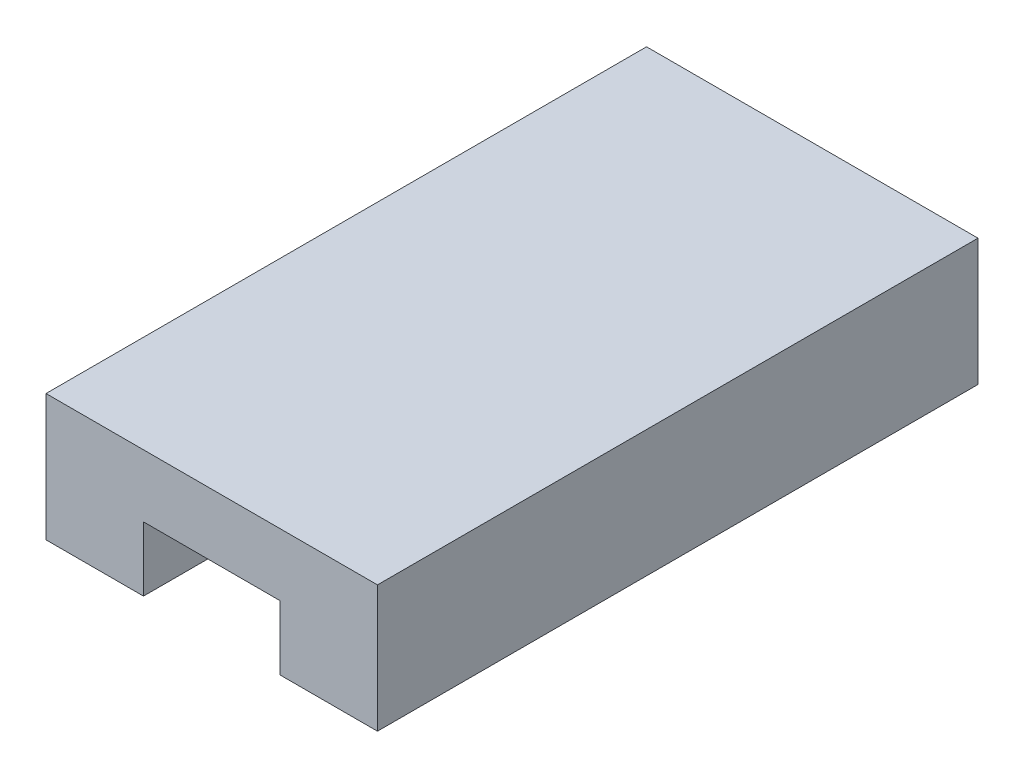
ISO-10303-21;
HEADER;
FILE_DESCRIPTION(('STEP AP214'),'2;1');
FILE_NAME('part.step','',(''),(''),'','','');
FILE_SCHEMA(('AUTOMOTIVE_DESIGN { 1 0 10303 214 1 1 1 1 }'));
ENDSEC;
DATA;
#1=APPLICATION_CONTEXT('core data for automotive mechanical design processes');
#2=APPLICATION_PROTOCOL_DEFINITION('international standard','automotive_design',2000,#1);
#3=PRODUCT_CONTEXT('',#1,'mechanical');
#4=PRODUCT('Part','Part','',(#3));
#5=PRODUCT_RELATED_PRODUCT_CATEGORY('part','',(#4));
#6=PRODUCT_DEFINITION_FORMATION('','',#4);
#7=PRODUCT_DEFINITION_CONTEXT('part definition',#1,'design');
#8=PRODUCT_DEFINITION('design','',#6,#7);
#9=PRODUCT_DEFINITION_SHAPE('','',#8);
#10=(LENGTH_UNIT() NAMED_UNIT(*) SI_UNIT(.MILLI.,.METRE.));
#11=(NAMED_UNIT(*) PLANE_ANGLE_UNIT() SI_UNIT($,.RADIAN.));
#12=(NAMED_UNIT(*) SI_UNIT($,.STERADIAN.) SOLID_ANGLE_UNIT());
#13=UNCERTAINTY_MEASURE_WITH_UNIT(LENGTH_MEASURE(1.E-05),#10,'distance_accuracy_value','');
#14=(GEOMETRIC_REPRESENTATION_CONTEXT(3) GLOBAL_UNCERTAINTY_ASSIGNED_CONTEXT((#13)) GLOBAL_UNIT_ASSIGNED_CONTEXT((#10,
#11,#12)) REPRESENTATION_CONTEXT('',''));
#15=CARTESIAN_POINT('',(0.,0.,0.));
#16=DIRECTION('',(0.,0.,1.));
#17=DIRECTION('',(1.,0.,0.));
#18=AXIS2_PLACEMENT_3D('',#15,#16,#17);
#19=CARTESIAN_POINT('',(-8.5,0.,15.4));
#20=DIRECTION('',(-1.,0.,0.));
#21=DIRECTION('',(0.,0.,1.));
#22=AXIS2_PLACEMENT_3D('',#19,#20,#21);
#23=PLANE('',#22);
#24=DIRECTION('',(0.,1.,0.));
#25=VECTOR('',#24,1.);
#26=CARTESIAN_POINT('',(-8.5,0.,-15.4));
#27=LINE('',#26,#25);
#28=CARTESIAN_POINT('',(-8.5,-0.900000000000002,-15.4));
#29=VERTEX_POINT('',#28);
#30=CARTESIAN_POINT('',(-8.5,5.6,-15.4));
#31=VERTEX_POINT('',#30);
#32=EDGE_CURVE('E168',#29,#31,#27,.T.);
#33=ORIENTED_EDGE('',*,*,#32,.F.);
#34=DIRECTION('',(0.,0.,-1.));
#35=VECTOR('',#34,1.);
#36=CARTESIAN_POINT('',(-8.5,-0.900000000000002,15.4));
#37=LINE('',#36,#35);
#38=CARTESIAN_POINT('',(-8.5,-0.900000000000002,15.4));
#39=VERTEX_POINT('',#38);
#40=EDGE_CURVE('E11',#39,#29,#37,.T.);
#41=ORIENTED_EDGE('',*,*,#40,.F.);
#42=DIRECTION('',(0.,1.,0.));
#43=VECTOR('',#42,1.);
#44=CARTESIAN_POINT('',(-8.5,0.,15.4));
#45=LINE('',#44,#43);
#46=CARTESIAN_POINT('',(-8.5,5.6,15.4));
#47=VERTEX_POINT('',#46);
#48=EDGE_CURVE('E133',#39,#47,#45,.T.);
#49=ORIENTED_EDGE('',*,*,#48,.T.);
#50=DIRECTION('',(0.,0.,-1.));
#51=VECTOR('',#50,1.);
#52=CARTESIAN_POINT('',(-8.5,5.6,15.4));
#53=LINE('',#52,#51);
#54=EDGE_CURVE('E87',#47,#31,#53,.T.);
#55=ORIENTED_EDGE('',*,*,#54,.T.);
#56=EDGE_LOOP('',(#33,#41,#49,#55));
#57=FACE_BOUND('',#56,.T.);
#58=ADVANCED_FACE('F37',(#57),#23,.T.);
#59=CARTESIAN_POINT('',(0.,-0.900000000000001,15.4));
#60=DIRECTION('',(0.,-1.,0.));
#61=DIRECTION('',(1.,0.,0.));
#62=AXIS2_PLACEMENT_3D('',#59,#60,#61);
#63=PLANE('',#62);
#64=DIRECTION('',(-1.,0.,0.));
#65=VECTOR('',#64,1.);
#66=CARTESIAN_POINT('',(0.,-0.900000000000001,-15.4));
#67=LINE('',#66,#65);
#68=CARTESIAN_POINT('',(-3.5,-0.900000000000001,-15.4));
#69=VERTEX_POINT('',#68);
#70=EDGE_CURVE('E162',#69,#29,#67,.T.);
#71=ORIENTED_EDGE('',*,*,#70,.F.);
#72=DIRECTION('',(0.,0.,-1.));
#73=VECTOR('',#72,1.);
#74=CARTESIAN_POINT('',(-3.5,-0.900000000000001,15.4));
#75=LINE('',#74,#73);
#76=CARTESIAN_POINT('',(-3.5,-0.900000000000001,15.4));
#77=VERTEX_POINT('',#76);
#78=EDGE_CURVE('E45',#77,#69,#75,.T.);
#79=ORIENTED_EDGE('',*,*,#78,.F.);
#80=DIRECTION('',(-1.,0.,0.));
#81=VECTOR('',#80,1.);
#82=CARTESIAN_POINT('',(0.,-0.900000000000001,15.4));
#83=LINE('',#82,#81);
#84=EDGE_CURVE('E126',#77,#39,#83,.T.);
#85=ORIENTED_EDGE('',*,*,#84,.T.);
#86=ORIENTED_EDGE('',*,*,#40,.T.);
#87=EDGE_LOOP('',(#71,#79,#85,#86));
#88=FACE_BOUND('',#87,.T.);
#89=ADVANCED_FACE('F167',(#88),#63,.T.);
#90=CARTESIAN_POINT('',(-3.5,0.,15.4));
#91=DIRECTION('',(-1.,0.,0.));
#92=DIRECTION('',(0.,0.,1.));
#93=AXIS2_PLACEMENT_3D('',#90,#91,#92);
#94=PLANE('',#93);
#95=DIRECTION('',(0.,1.,0.));
#96=VECTOR('',#95,1.);
#97=CARTESIAN_POINT('',(-3.5,0.,-15.4));
#98=LINE('',#97,#96);
#99=CARTESIAN_POINT('',(-3.5,2.4,-15.4));
#100=VERTEX_POINT('',#99);
#101=EDGE_CURVE('E156',#69,#100,#98,.T.);
#102=ORIENTED_EDGE('',*,*,#101,.T.);
#103=DIRECTION('',(0.,0.,-1.));
#104=VECTOR('',#103,1.);
#105=CARTESIAN_POINT('',(-3.5,2.4,15.4));
#106=LINE('',#105,#104);
#107=CARTESIAN_POINT('',(-3.5,2.4,15.4));
#108=VERTEX_POINT('',#107);
#109=EDGE_CURVE('E149',#108,#100,#106,.T.);
#110=ORIENTED_EDGE('',*,*,#109,.F.);
#111=DIRECTION('',(0.,1.,0.));
#112=VECTOR('',#111,1.);
#113=CARTESIAN_POINT('',(-3.5,0.,15.4));
#114=LINE('',#113,#112);
#115=EDGE_CURVE('E132',#77,#108,#114,.T.);
#116=ORIENTED_EDGE('',*,*,#115,.F.);
#117=ORIENTED_EDGE('',*,*,#78,.T.);
#118=EDGE_LOOP('',(#102,#110,#116,#117));
#119=FACE_BOUND('',#118,.T.);
#120=ADVANCED_FACE('F154',(#119),#94,.F.);
#121=CARTESIAN_POINT('',(0.,2.4,15.4));
#122=DIRECTION('',(0.,-1.,0.));
#123=DIRECTION('',(1.,0.,0.));
#124=AXIS2_PLACEMENT_3D('',#121,#122,#123);
#125=PLANE('',#124);
#126=DIRECTION('',(-1.,0.,0.));
#127=VECTOR('',#126,1.);
#128=CARTESIAN_POINT('',(0.,2.4,-15.4));
#129=LINE('',#128,#127);
#130=CARTESIAN_POINT('',(3.5,2.4,-15.4));
#131=VERTEX_POINT('',#130);
#132=EDGE_CURVE('E165',#131,#100,#129,.T.);
#133=ORIENTED_EDGE('',*,*,#132,.F.);
#134=DIRECTION('',(0.,0.,-1.));
#135=VECTOR('',#134,1.);
#136=CARTESIAN_POINT('',(3.5,2.4,15.4));
#137=LINE('',#136,#135);
#138=CARTESIAN_POINT('',(3.5,2.4,15.4));
#139=VERTEX_POINT('',#138);
#140=EDGE_CURVE('E147',#139,#131,#137,.T.);
#141=ORIENTED_EDGE('',*,*,#140,.F.);
#142=DIRECTION('',(-1.,0.,0.));
#143=VECTOR('',#142,1.);
#144=CARTESIAN_POINT('',(0.,2.4,15.4));
#145=LINE('',#144,#143);
#146=EDGE_CURVE('E127',#139,#108,#145,.T.);
#147=ORIENTED_EDGE('',*,*,#146,.T.);
#148=ORIENTED_EDGE('',*,*,#109,.T.);
#149=EDGE_LOOP('',(#133,#141,#147,#148));
#150=FACE_BOUND('',#149,.T.);
#151=ADVANCED_FACE('F178',(#150),#125,.T.);
#152=CARTESIAN_POINT('',(3.5,0.,15.4));
#153=DIRECTION('',(-1.,0.,0.));
#154=DIRECTION('',(0.,0.,1.));
#155=AXIS2_PLACEMENT_3D('',#152,#153,#154);
#156=PLANE('',#155);
#157=DIRECTION('',(0.,1.,0.));
#158=VECTOR('',#157,1.);
#159=CARTESIAN_POINT('',(3.5,0.,-15.4));
#160=LINE('',#159,#158);
#161=CARTESIAN_POINT('',(3.5,-0.900000000000001,-15.4));
#162=VERTEX_POINT('',#161);
#163=EDGE_CURVE('E171',#162,#131,#160,.T.);
#164=ORIENTED_EDGE('',*,*,#163,.F.);
#165=DIRECTION('',(0.,0.,-1.));
#166=VECTOR('',#165,1.);
#167=CARTESIAN_POINT('',(3.5,-0.900000000000001,15.4));
#168=LINE('',#167,#166);
#169=CARTESIAN_POINT('',(3.5,-0.900000000000001,15.4));
#170=VERTEX_POINT('',#169);
#171=EDGE_CURVE('E114',#170,#162,#168,.T.);
#172=ORIENTED_EDGE('',*,*,#171,.F.);
#173=DIRECTION('',(0.,1.,0.));
#174=VECTOR('',#173,1.);
#175=CARTESIAN_POINT('',(3.5,0.,15.4));
#176=LINE('',#175,#174);
#177=EDGE_CURVE('E124',#170,#139,#176,.T.);
#178=ORIENTED_EDGE('',*,*,#177,.T.);
#179=ORIENTED_EDGE('',*,*,#140,.T.);
#180=EDGE_LOOP('',(#164,#172,#178,#179));
#181=FACE_BOUND('',#180,.T.);
#182=ADVANCED_FACE('F175',(#181),#156,.T.);
#183=CARTESIAN_POINT('',(8.5,-0.9,-15.4));
#184=VERTEX_POINT('',#183);
#185=EDGE_CURVE('E113',#184,#162,#67,.T.);
#186=ORIENTED_EDGE('',*,*,#185,.F.);
#187=DIRECTION('',(0.,0.,-1.));
#188=VECTOR('',#187,1.);
#189=CARTESIAN_POINT('',(8.5,-0.9,15.4));
#190=LINE('',#189,#188);
#191=CARTESIAN_POINT('',(8.5,-0.9,15.4));
#192=VERTEX_POINT('',#191);
#193=EDGE_CURVE('E107',#192,#184,#190,.T.);
#194=ORIENTED_EDGE('',*,*,#193,.F.);
#195=EDGE_CURVE('E111',#192,#170,#83,.T.);
#196=ORIENTED_EDGE('',*,*,#195,.T.);
#197=ORIENTED_EDGE('',*,*,#171,.T.);
#198=EDGE_LOOP('',(#186,#194,#196,#197));
#199=FACE_BOUND('',#198,.T.);
#200=ADVANCED_FACE('F109',(#199),#63,.T.);
#201=CARTESIAN_POINT('',(8.5,0.,15.4));
#202=DIRECTION('',(-1.,0.,0.));
#203=DIRECTION('',(0.,0.,1.));
#204=AXIS2_PLACEMENT_3D('',#201,#202,#203);
#205=PLANE('',#204);
#206=DIRECTION('',(0.,1.,0.));
#207=VECTOR('',#206,1.);
#208=CARTESIAN_POINT('',(8.5,0.,-15.4));
#209=LINE('',#208,#207);
#210=CARTESIAN_POINT('',(8.5,5.6,-15.4));
#211=VERTEX_POINT('',#210);
#212=EDGE_CURVE('E80',#184,#211,#209,.T.);
#213=ORIENTED_EDGE('',*,*,#212,.T.);
#214=DIRECTION('',(0.,0.,-1.));
#215=VECTOR('',#214,1.);
#216=CARTESIAN_POINT('',(8.5,5.6,15.4));
#217=LINE('',#216,#215);
#218=CARTESIAN_POINT('',(8.5,5.6,15.4));
#219=VERTEX_POINT('',#218);
#220=EDGE_CURVE('E115',#219,#211,#217,.T.);
#221=ORIENTED_EDGE('',*,*,#220,.F.);
#222=DIRECTION('',(0.,1.,0.));
#223=VECTOR('',#222,1.);
#224=CARTESIAN_POINT('',(8.5,0.,15.4));
#225=LINE('',#224,#223);
#226=EDGE_CURVE('E117',#192,#219,#225,.T.);
#227=ORIENTED_EDGE('',*,*,#226,.F.);
#228=ORIENTED_EDGE('',*,*,#193,.T.);
#229=EDGE_LOOP('',(#213,#221,#227,#228));
#230=FACE_BOUND('',#229,.T.);
#231=ADVANCED_FACE('F118',(#230),#205,.F.);
#232=CARTESIAN_POINT('',(0.,5.6,15.4));
#233=DIRECTION('',(0.,-1.,0.));
#234=DIRECTION('',(1.,0.,0.));
#235=AXIS2_PLACEMENT_3D('',#232,#233,#234);
#236=PLANE('',#235);
#237=DIRECTION('',(-1.,0.,0.));
#238=VECTOR('',#237,1.);
#239=CARTESIAN_POINT('',(0.,5.6,-15.4));
#240=LINE('',#239,#238);
#241=EDGE_CURVE('E136',#211,#31,#240,.T.);
#242=ORIENTED_EDGE('',*,*,#241,.T.);
#243=ORIENTED_EDGE('',*,*,#54,.F.);
#244=DIRECTION('',(-1.,0.,0.));
#245=VECTOR('',#244,1.);
#246=CARTESIAN_POINT('',(0.,5.6,15.4));
#247=LINE('',#246,#245);
#248=EDGE_CURVE('E53',#219,#47,#247,.T.);
#249=ORIENTED_EDGE('',*,*,#248,.F.);
#250=ORIENTED_EDGE('',*,*,#220,.T.);
#251=EDGE_LOOP('',(#242,#243,#249,#250));
#252=FACE_BOUND('',#251,.T.);
#253=ADVANCED_FACE('F200',(#252),#236,.F.);
#254=CARTESIAN_POINT('',(0.,0.,15.4));
#255=DIRECTION('',(0.,0.,1.));
#256=DIRECTION('',(1.,0.,0.));
#257=AXIS2_PLACEMENT_3D('',#254,#255,#256);
#258=PLANE('',#257);
#259=ORIENTED_EDGE('',*,*,#48,.F.);
#260=ORIENTED_EDGE('',*,*,#84,.F.);
#261=ORIENTED_EDGE('',*,*,#115,.T.);
#262=ORIENTED_EDGE('',*,*,#146,.F.);
#263=ORIENTED_EDGE('',*,*,#177,.F.);
#264=ORIENTED_EDGE('',*,*,#195,.F.);
#265=ORIENTED_EDGE('',*,*,#226,.T.);
#266=ORIENTED_EDGE('',*,*,#248,.T.);
#267=EDGE_LOOP('',(#259,#260,#261,#262,#263,#264,#265,#266));
#268=FACE_BOUND('',#267,.T.);
#269=ADVANCED_FACE('F121',(#268),#258,.T.);
#270=CARTESIAN_POINT('',(0.,0.,-15.4));
#271=DIRECTION('',(0.,0.,1.));
#272=DIRECTION('',(1.,0.,0.));
#273=AXIS2_PLACEMENT_3D('',#270,#271,#272);
#274=PLANE('',#273);
#275=ORIENTED_EDGE('',*,*,#32,.T.);
#276=ORIENTED_EDGE('',*,*,#241,.F.);
#277=ORIENTED_EDGE('',*,*,#212,.F.);
#278=ORIENTED_EDGE('',*,*,#185,.T.);
#279=ORIENTED_EDGE('',*,*,#163,.T.);
#280=ORIENTED_EDGE('',*,*,#132,.T.);
#281=ORIENTED_EDGE('',*,*,#101,.F.);
#282=ORIENTED_EDGE('',*,*,#70,.T.);
#283=EDGE_LOOP('',(#275,#276,#277,#278,#279,#280,#281,#282));
#284=FACE_BOUND('',#283,.T.);
#285=ADVANCED_FACE('F161',(#284),#274,.F.);
#286=CLOSED_SHELL('',(#58,#89,#120,#151,#182,#200,#231,#253,#269,#285));
#287=MANIFOLD_SOLID_BREP('B2',#286);
#288=ADVANCED_BREP_SHAPE_REPRESENTATION('',(#18,#287),#14);
#289=SHAPE_DEFINITION_REPRESENTATION(#9,#288);
ENDSEC;
END-ISO-10303-21;
